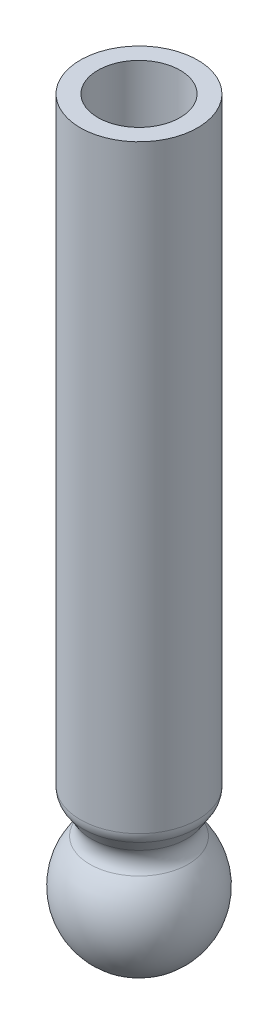
ISO-10303-21;
HEADER;
FILE_DESCRIPTION(('STEP AP214'),'2;1');
FILE_NAME('part.step','',(''),(''),'','','');
FILE_SCHEMA(('AUTOMOTIVE_DESIGN { 1 0 10303 214 1 1 1 1 }'));
ENDSEC;
DATA;
#1=APPLICATION_CONTEXT('core data for automotive mechanical design processes');
#2=APPLICATION_PROTOCOL_DEFINITION('international standard','automotive_design',2000,#1);
#3=PRODUCT_CONTEXT('',#1,'mechanical');
#4=PRODUCT('Part','Part','',(#3));
#5=PRODUCT_RELATED_PRODUCT_CATEGORY('part','',(#4));
#6=PRODUCT_DEFINITION_FORMATION('','',#4);
#7=PRODUCT_DEFINITION_CONTEXT('part definition',#1,'design');
#8=PRODUCT_DEFINITION('design','',#6,#7);
#9=PRODUCT_DEFINITION_SHAPE('','',#8);
#10=(LENGTH_UNIT() NAMED_UNIT(*) SI_UNIT(.MILLI.,.METRE.));
#11=(NAMED_UNIT(*) PLANE_ANGLE_UNIT() SI_UNIT($,.RADIAN.));
#12=(NAMED_UNIT(*) SI_UNIT($,.STERADIAN.) SOLID_ANGLE_UNIT());
#13=UNCERTAINTY_MEASURE_WITH_UNIT(LENGTH_MEASURE(1.E-05),#10,'distance_accuracy_value','');
#14=(GEOMETRIC_REPRESENTATION_CONTEXT(3) GLOBAL_UNCERTAINTY_ASSIGNED_CONTEXT((#13)) GLOBAL_UNIT_ASSIGNED_CONTEXT((#10,
#11,#12)) REPRESENTATION_CONTEXT('',''));
#15=CARTESIAN_POINT('',(0.,0.,0.));
#16=DIRECTION('',(0.,0.,1.));
#17=DIRECTION('',(1.,0.,0.));
#18=AXIS2_PLACEMENT_3D('',#15,#16,#17);
#19=CARTESIAN_POINT('',(0.,3.,0.));
#20=DIRECTION('',(0.,-1.,0.));
#21=DIRECTION('',(0.,0.,-1.));
#22=AXIS2_PLACEMENT_3D('',#19,#20,#21);
#23=CYLINDRICAL_SURFACE('',#22,10.);
#24=CARTESIAN_POINT('',(0.,0.889320203943031,0.));
#25=DIRECTION('',(0.,1.,0.));
#26=DIRECTION('',(0.,0.,1.));
#27=AXIS2_PLACEMENT_3D('',#24,#25,#26);
#28=CIRCLE('',#27,10.);
#29=CARTESIAN_POINT('',(0.,0.889320203943031,10.));
#30=VERTEX_POINT('',#29);
#31=EDGE_CURVE('E11',#30,#30,#28,.T.);
#32=ORIENTED_EDGE('',*,*,#31,.T.);
#33=EDGE_LOOP('',(#32));
#34=FACE_BOUND('',#33,.T.);
#35=CARTESIAN_POINT('',(0.,103.,0.));
#36=DIRECTION('',(0.,1.,0.));
#37=DIRECTION('',(0.,0.,1.));
#38=AXIS2_PLACEMENT_3D('',#35,#36,#37);
#39=CIRCLE('',#38,10.);
#40=CARTESIAN_POINT('',(0.,103.,10.));
#41=VERTEX_POINT('',#40);
#42=EDGE_CURVE('E67',#41,#41,#39,.T.);
#43=ORIENTED_EDGE('',*,*,#42,.F.);
#44=EDGE_LOOP('',(#43));
#45=FACE_BOUND('',#44,.T.);
#46=ADVANCED_FACE('F39',(#34,#45),#23,.T.);
#47=CARTESIAN_POINT('',(0.,103.,0.));
#48=DIRECTION('',(0.,1.,0.));
#49=DIRECTION('',(0.,0.,1.));
#50=AXIS2_PLACEMENT_3D('',#47,#48,#49);
#51=PLANE('',#50);
#52=ORIENTED_EDGE('',*,*,#42,.T.);
#53=EDGE_LOOP('',(#52));
#54=FACE_BOUND('',#53,.T.);
#55=CARTESIAN_POINT('',(0.,103.,0.));
#56=DIRECTION('',(0.,1.,0.));
#57=DIRECTION('',(0.,0.,1.));
#58=AXIS2_PLACEMENT_3D('',#55,#56,#57);
#59=CIRCLE('',#58,7.);
#60=CARTESIAN_POINT('',(0.,103.,7.));
#61=VERTEX_POINT('',#60);
#62=EDGE_CURVE('E71',#61,#61,#59,.T.);
#63=ORIENTED_EDGE('',*,*,#62,.F.);
#64=EDGE_LOOP('',(#63));
#65=FACE_BOUND('',#64,.T.);
#66=ADVANCED_FACE('F79',(#54,#65),#51,.T.);
#67=CARTESIAN_POINT('',(0.,103.,0.));
#68=DIRECTION('',(0.,-1.,0.));
#69=DIRECTION('',(0.,0.,-1.));
#70=AXIS2_PLACEMENT_3D('',#67,#68,#69);
#71=CYLINDRICAL_SURFACE('',#70,7.);
#72=ORIENTED_EDGE('',*,*,#62,.T.);
#73=EDGE_LOOP('',(#72));
#74=FACE_BOUND('',#73,.T.);
#75=CARTESIAN_POINT('',(0.,3.,0.));
#76=DIRECTION('',(0.,1.,0.));
#77=DIRECTION('',(0.,0.,1.));
#78=AXIS2_PLACEMENT_3D('',#75,#76,#77);
#79=CIRCLE('',#78,7.);
#80=CARTESIAN_POINT('',(0.,3.,7.));
#81=VERTEX_POINT('',#80);
#82=EDGE_CURVE('E63',#81,#81,#79,.F.);
#83=ORIENTED_EDGE('',*,*,#82,.T.);
#84=EDGE_LOOP('',(#83));
#85=FACE_BOUND('',#84,.T.);
#86=ADVANCED_FACE('F76',(#74,#85),#71,.F.);
#87=CARTESIAN_POINT('',(0.,3.,0.));
#88=DIRECTION('',(0.,1.,0.));
#89=DIRECTION('',(0.,0.,1.));
#90=AXIS2_PLACEMENT_3D('',#87,#88,#89);
#91=PLANE('',#90);
#92=ORIENTED_EDGE('',*,*,#82,.F.);
#93=EDGE_LOOP('',(#92));
#94=FACE_BOUND('',#93,.T.);
#95=ADVANCED_FACE('F87',(#94),#91,.T.);
#96=CARTESIAN_POINT('',(0.,-13.8609375,0.));
#97=DIRECTION('',(0.,0.,1.));
#98=DIRECTION('',(1.,0.,0.));
#99=AXIS2_PLACEMENT_3D('',#96,#97,#98);
#100=SPHERICAL_SURFACE('',#99,11.1390625);
#101=CARTESIAN_POINT('',(0.,-13.8609375,0.));
#102=DIRECTION('',(0.,-1.,0.));
#103=DIRECTION('',(0.,0.,-1.));
#104=AXIS2_PLACEMENT_3D('',#101,#102,#103);
#105=SPHERICAL_SURFACE('',#104,11.1390625);
#106=CARTESIAN_POINT('',(0.,-6.51530020198366,0.));
#107=DIRECTION('',(0.,-1.,0.));
#108=DIRECTION('',(0.,0.,-1.));
#109=AXIS2_PLACEMENT_3D('',#106,#107,#108);
#110=CIRCLE('',#109,8.37378803558446);
#111=CARTESIAN_POINT('',(0.,-6.51530020198366,-8.37378803558446));
#112=VERTEX_POINT('',#111);
#113=EDGE_CURVE('E57',#112,#112,#110,.T.);
#114=ORIENTED_EDGE('',*,*,#113,.T.);
#115=EDGE_LOOP('',(#114));
#116=FACE_BOUND('',#115,.T.);
#117=ADVANCED_FACE('F94',(#116),#105,.T.);
#118=CARTESIAN_POINT('',(0.,-5.,0.));
#119=DIRECTION('',(0.,1.,0.));
#120=DIRECTION('',(0.,0.,1.));
#121=AXIS2_PLACEMENT_3D('',#118,#119,#120);
#122=CONICAL_SURFACE('',#121,6.75,0.576375220591184);
#123=CARTESIAN_POINT('',(0.,-2.90198985461721,0.));
#124=DIRECTION('',(0.,1.,0.));
#125=DIRECTION('',(0.,0.,1.));
#126=AXIS2_PLACEMENT_3D('',#123,#124,#125);
#127=CIRCLE('',#126,8.11370659449882);
#128=CARTESIAN_POINT('',(0.,-2.90198985461721,8.11370659449882));
#129=VERTEX_POINT('',#128);
#130=EDGE_CURVE('E47',#129,#129,#127,.T.);
#131=ORIENTED_EDGE('',*,*,#130,.T.);
#132=EDGE_LOOP('',(#131));
#133=FACE_BOUND('',#132,.T.);
#134=CARTESIAN_POINT('',(0.,-0.745644847843212,0.));
#135=DIRECTION('',(0.,1.,0.));
#136=DIRECTION('',(0.,0.,1.));
#137=AXIS2_PLACEMENT_3D('',#134,#135,#136);
#138=CIRCLE('',#137,9.51533084890191);
#139=CARTESIAN_POINT('',(0.,-0.745644847843212,9.51533084890191));
#140=VERTEX_POINT('',#139);
#141=EDGE_CURVE('E52',#140,#140,#138,.F.);
#142=ORIENTED_EDGE('',*,*,#141,.T.);
#143=EDGE_LOOP('',(#142));
#144=FACE_BOUND('',#143,.T.);
#145=ADVANCED_FACE('F98',(#133,#144),#122,.T.);
#146=CARTESIAN_POINT('',(0.,-4.53695490640345,0.));
#147=DIRECTION('',(0.,-1.,0.));
#148=DIRECTION('',(0.,0.,-1.));
#149=AXIS2_PLACEMENT_3D('',#146,#147,#148);
#150=TOROIDAL_SURFACE('',#149,10.6290374434007,3.);
#151=ORIENTED_EDGE('',*,*,#130,.F.);
#152=EDGE_LOOP('',(#151));
#153=FACE_BOUND('',#152,.T.);
#154=ORIENTED_EDGE('',*,*,#113,.F.);
#155=EDGE_LOOP('',(#154));
#156=FACE_BOUND('',#155,.T.);
#157=ADVANCED_FACE('F100',(#153,#156),#150,.F.);
#158=CARTESIAN_POINT('',(0.,0.889320203943031,0.));
#159=DIRECTION('',(0.,1.,0.));
#160=DIRECTION('',(0.,0.,1.));
#161=AXIS2_PLACEMENT_3D('',#158,#159,#160);
#162=TOROIDAL_SURFACE('',#161,7.,3.);
#163=ORIENTED_EDGE('',*,*,#31,.F.);
#164=EDGE_LOOP('',(#163));
#165=FACE_BOUND('',#164,.T.);
#166=ORIENTED_EDGE('',*,*,#141,.F.);
#167=EDGE_LOOP('',(#166));
#168=FACE_BOUND('',#167,.T.);
#169=ADVANCED_FACE('F41',(#165,#168),#162,.T.);
#170=CLOSED_SHELL('',(#46,#66,#86,#95,#117,#145,#157,#169));
#171=MANIFOLD_SOLID_BREP('B2',#170);
#172=ADVANCED_BREP_SHAPE_REPRESENTATION('',(#18,#171),#14);
#173=SHAPE_DEFINITION_REPRESENTATION(#9,#172);
ENDSEC;
END-ISO-10303-21;
